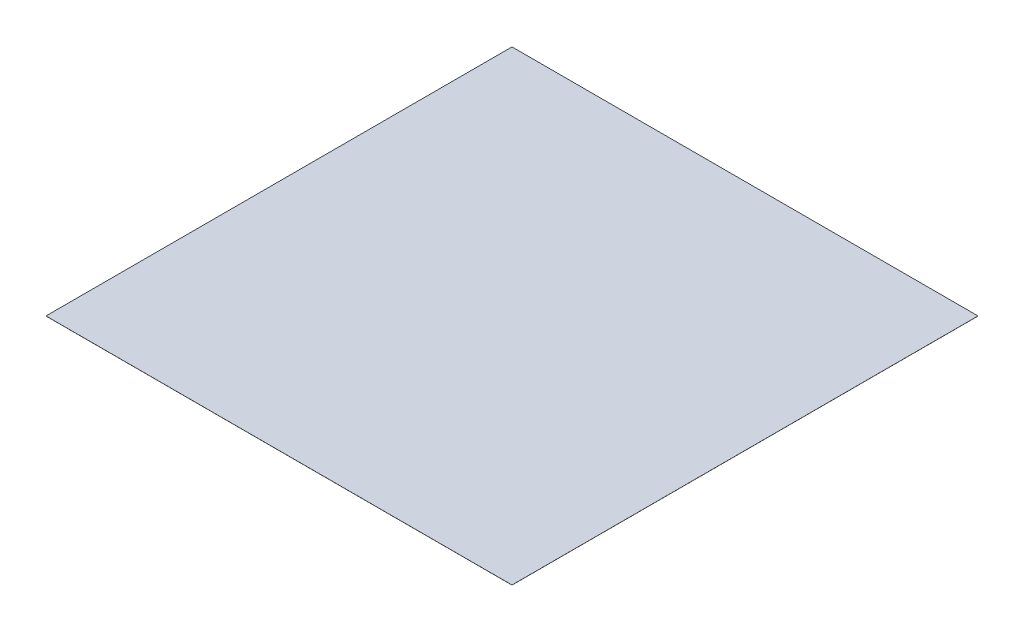
ISO-10303-21;
HEADER;
FILE_DESCRIPTION(('STEP AP214'),'2;1');
FILE_NAME('part.step','',(''),(''),'','','');
FILE_SCHEMA(('AUTOMOTIVE_DESIGN { 1 0 10303 214 1 1 1 1 }'));
ENDSEC;
DATA;
#1=APPLICATION_CONTEXT('core data for automotive mechanical design processes');
#2=APPLICATION_PROTOCOL_DEFINITION('international standard','automotive_design',2000,#1);
#3=PRODUCT_CONTEXT('',#1,'mechanical');
#4=PRODUCT('Part','Part','',(#3));
#5=PRODUCT_RELATED_PRODUCT_CATEGORY('part','',(#4));
#6=PRODUCT_DEFINITION_FORMATION('','',#4);
#7=PRODUCT_DEFINITION_CONTEXT('part definition',#1,'design');
#8=PRODUCT_DEFINITION('design','',#6,#7);
#9=PRODUCT_DEFINITION_SHAPE('','',#8);
#10=(LENGTH_UNIT() NAMED_UNIT(*) SI_UNIT(.MILLI.,.METRE.));
#11=(NAMED_UNIT(*) PLANE_ANGLE_UNIT() SI_UNIT($,.RADIAN.));
#12=(NAMED_UNIT(*) SI_UNIT($,.STERADIAN.) SOLID_ANGLE_UNIT());
#13=UNCERTAINTY_MEASURE_WITH_UNIT(LENGTH_MEASURE(1.E-05),#10,'distance_accuracy_value','');
#14=(GEOMETRIC_REPRESENTATION_CONTEXT(3) GLOBAL_UNCERTAINTY_ASSIGNED_CONTEXT((#13)) GLOBAL_UNIT_ASSIGNED_CONTEXT((#10,
#11,#12)) REPRESENTATION_CONTEXT('',''));
#15=CARTESIAN_POINT('',(0.,0.,0.));
#16=DIRECTION('',(0.,0.,1.));
#17=DIRECTION('',(1.,0.,0.));
#18=AXIS2_PLACEMENT_3D('',#15,#16,#17);
#19=CARTESIAN_POINT('',(0.,2.54,0.));
#20=DIRECTION('',(1.,0.,0.));
#21=DIRECTION('',(0.,0.,-1.));
#22=AXIS2_PLACEMENT_3D('',#19,#20,#21);
#23=PLANE('',#22);
#24=DIRECTION('',(0.,0.,1.));
#25=VECTOR('',#24,1.);
#26=CARTESIAN_POINT('',(0.,0.,0.));
#27=LINE('',#26,#25);
#28=CARTESIAN_POINT('',(0.,0.,-12700.));
#29=VERTEX_POINT('',#28);
#30=CARTESIAN_POINT('',(0.,0.,0.));
#31=VERTEX_POINT('',#30);
#32=EDGE_CURVE('E96',#29,#31,#27,.T.);
#33=ORIENTED_EDGE('',*,*,#32,.T.);
#34=DIRECTION('',(0.,-1.,0.));
#35=VECTOR('',#34,1.);
#36=CARTESIAN_POINT('',(0.,2.54,0.));
#37=LINE('',#36,#35);
#38=CARTESIAN_POINT('',(0.,2.54,0.));
#39=VERTEX_POINT('',#38);
#40=EDGE_CURVE('E11',#39,#31,#37,.T.);
#41=ORIENTED_EDGE('',*,*,#40,.F.);
#42=DIRECTION('',(0.,0.,1.));
#43=VECTOR('',#42,1.);
#44=CARTESIAN_POINT('',(0.,2.54,0.));
#45=LINE('',#44,#43);
#46=CARTESIAN_POINT('',(0.,2.54,-12700.));
#47=VERTEX_POINT('',#46);
#48=EDGE_CURVE('E84',#47,#39,#45,.T.);
#49=ORIENTED_EDGE('',*,*,#48,.F.);
#50=DIRECTION('',(0.,-1.,0.));
#51=VECTOR('',#50,1.);
#52=CARTESIAN_POINT('',(0.,2.54,-12700.));
#53=LINE('',#52,#51);
#54=EDGE_CURVE('E92',#47,#29,#53,.T.);
#55=ORIENTED_EDGE('',*,*,#54,.T.);
#56=EDGE_LOOP('',(#33,#41,#49,#55));
#57=FACE_BOUND('',#56,.T.);
#58=ADVANCED_FACE('F33',(#57),#23,.F.);
#59=CARTESIAN_POINT('',(0.,2.54,0.));
#60=DIRECTION('',(0.,0.,-1.));
#61=DIRECTION('',(-1.,0.,0.));
#62=AXIS2_PLACEMENT_3D('',#59,#60,#61);
#63=PLANE('',#62);
#64=DIRECTION('',(1.,0.,0.));
#65=VECTOR('',#64,1.);
#66=CARTESIAN_POINT('',(0.,0.,0.));
#67=LINE('',#66,#65);
#68=CARTESIAN_POINT('',(12700.,0.,0.));
#69=VERTEX_POINT('',#68);
#70=EDGE_CURVE('E88',#31,#69,#67,.T.);
#71=ORIENTED_EDGE('',*,*,#70,.T.);
#72=DIRECTION('',(0.,-1.,0.));
#73=VECTOR('',#72,1.);
#74=CARTESIAN_POINT('',(12700.,2.54,0.));
#75=LINE('',#74,#73);
#76=CARTESIAN_POINT('',(12700.,2.54,0.));
#77=VERTEX_POINT('',#76);
#78=EDGE_CURVE('E41',#77,#69,#75,.T.);
#79=ORIENTED_EDGE('',*,*,#78,.F.);
#80=DIRECTION('',(1.,0.,0.));
#81=VECTOR('',#80,1.);
#82=CARTESIAN_POINT('',(0.,2.54,0.));
#83=LINE('',#82,#81);
#84=EDGE_CURVE('E79',#39,#77,#83,.T.);
#85=ORIENTED_EDGE('',*,*,#84,.F.);
#86=ORIENTED_EDGE('',*,*,#40,.T.);
#87=EDGE_LOOP('',(#71,#79,#85,#86));
#88=FACE_BOUND('',#87,.T.);
#89=ADVANCED_FACE('F87',(#88),#63,.F.);
#90=CARTESIAN_POINT('',(12700.,2.54,0.));
#91=DIRECTION('',(-1.,0.,0.));
#92=DIRECTION('',(0.,0.,1.));
#93=AXIS2_PLACEMENT_3D('',#90,#91,#92);
#94=PLANE('',#93);
#95=DIRECTION('',(0.,0.,-1.));
#96=VECTOR('',#95,1.);
#97=CARTESIAN_POINT('',(12700.,0.,0.));
#98=LINE('',#97,#96);
#99=CARTESIAN_POINT('',(12700.,0.,-12700.));
#100=VERTEX_POINT('',#99);
#101=EDGE_CURVE('E66',#69,#100,#98,.T.);
#102=ORIENTED_EDGE('',*,*,#101,.T.);
#103=DIRECTION('',(0.,-1.,0.));
#104=VECTOR('',#103,1.);
#105=CARTESIAN_POINT('',(12700.,2.54,-12700.));
#106=LINE('',#105,#104);
#107=CARTESIAN_POINT('',(12700.,2.54,-12700.));
#108=VERTEX_POINT('',#107);
#109=EDGE_CURVE('E89',#108,#100,#106,.T.);
#110=ORIENTED_EDGE('',*,*,#109,.F.);
#111=DIRECTION('',(0.,0.,-1.));
#112=VECTOR('',#111,1.);
#113=CARTESIAN_POINT('',(12700.,2.54,0.));
#114=LINE('',#113,#112);
#115=EDGE_CURVE('E82',#77,#108,#114,.T.);
#116=ORIENTED_EDGE('',*,*,#115,.F.);
#117=ORIENTED_EDGE('',*,*,#78,.T.);
#118=EDGE_LOOP('',(#102,#110,#116,#117));
#119=FACE_BOUND('',#118,.T.);
#120=ADVANCED_FACE('F90',(#119),#94,.F.);
#121=CARTESIAN_POINT('',(0.,2.54,-12700.));
#122=DIRECTION('',(0.,0.,1.));
#123=DIRECTION('',(1.,0.,0.));
#124=AXIS2_PLACEMENT_3D('',#121,#122,#123);
#125=PLANE('',#124);
#126=DIRECTION('',(-1.,0.,0.));
#127=VECTOR('',#126,1.);
#128=CARTESIAN_POINT('',(0.,0.,-12700.));
#129=LINE('',#128,#127);
#130=EDGE_CURVE('E72',#100,#29,#129,.T.);
#131=ORIENTED_EDGE('',*,*,#130,.T.);
#132=ORIENTED_EDGE('',*,*,#54,.F.);
#133=DIRECTION('',(-1.,0.,0.));
#134=VECTOR('',#133,1.);
#135=CARTESIAN_POINT('',(0.,2.54,-12700.));
#136=LINE('',#135,#134);
#137=EDGE_CURVE('E49',#108,#47,#136,.T.);
#138=ORIENTED_EDGE('',*,*,#137,.F.);
#139=ORIENTED_EDGE('',*,*,#109,.T.);
#140=EDGE_LOOP('',(#131,#132,#138,#139));
#141=FACE_BOUND('',#140,.T.);
#142=ADVANCED_FACE('F103',(#141),#125,.F.);
#143=CARTESIAN_POINT('',(0.,2.54,0.));
#144=DIRECTION('',(0.,-1.,0.));
#145=DIRECTION('',(0.,0.,-1.));
#146=AXIS2_PLACEMENT_3D('',#143,#144,#145);
#147=PLANE('',#146);
#148=ORIENTED_EDGE('',*,*,#48,.T.);
#149=ORIENTED_EDGE('',*,*,#84,.T.);
#150=ORIENTED_EDGE('',*,*,#115,.T.);
#151=ORIENTED_EDGE('',*,*,#137,.T.);
#152=EDGE_LOOP('',(#148,#149,#150,#151));
#153=FACE_BOUND('',#152,.T.);
#154=ADVANCED_FACE('F80',(#153),#147,.F.);
#155=CARTESIAN_POINT('',(0.,0.,0.));
#156=DIRECTION('',(0.,-1.,0.));
#157=DIRECTION('',(0.,0.,-1.));
#158=AXIS2_PLACEMENT_3D('',#155,#156,#157);
#159=PLANE('',#158);
#160=ORIENTED_EDGE('',*,*,#32,.F.);
#161=ORIENTED_EDGE('',*,*,#130,.F.);
#162=ORIENTED_EDGE('',*,*,#101,.F.);
#163=ORIENTED_EDGE('',*,*,#70,.F.);
#164=EDGE_LOOP('',(#160,#161,#162,#163));
#165=FACE_BOUND('',#164,.T.);
#166=ADVANCED_FACE('F106',(#165),#159,.T.);
#167=CLOSED_SHELL('',(#58,#89,#120,#142,#154,#166));
#168=MANIFOLD_SOLID_BREP('B2',#167);
#169=ADVANCED_BREP_SHAPE_REPRESENTATION('',(#18,#168),#14);
#170=SHAPE_DEFINITION_REPRESENTATION(#9,#169);
ENDSEC;
END-ISO-10303-21;
